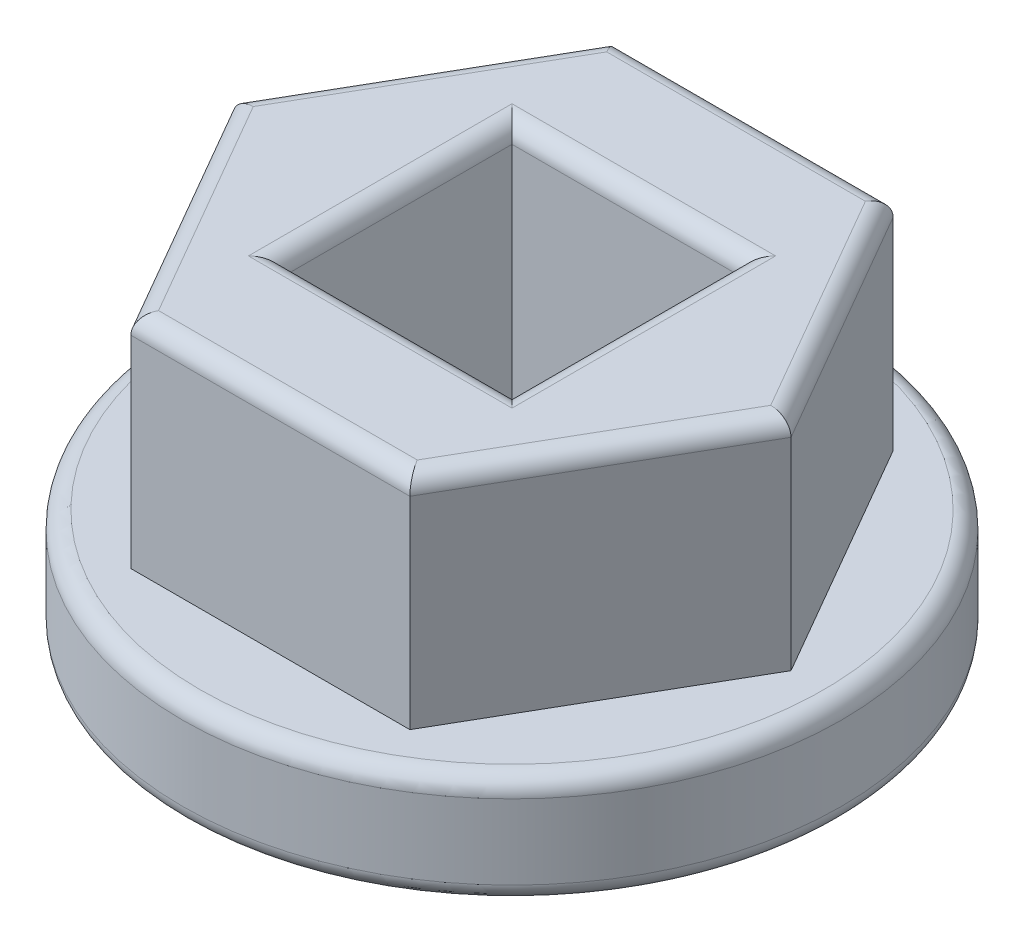
ISO-10303-21;
HEADER;
FILE_DESCRIPTION(('STEP AP214'),'2;1');
FILE_NAME('part.step','',(''),(''),'','','');
FILE_SCHEMA(('AUTOMOTIVE_DESIGN { 1 0 10303 214 1 1 1 1 }'));
ENDSEC;
DATA;
#1=APPLICATION_CONTEXT('core data for automotive mechanical design processes');
#2=APPLICATION_PROTOCOL_DEFINITION('international standard','automotive_design',2000,#1);
#3=PRODUCT_CONTEXT('',#1,'mechanical');
#4=PRODUCT('Part','Part','',(#3));
#5=PRODUCT_RELATED_PRODUCT_CATEGORY('part','',(#4));
#6=PRODUCT_DEFINITION_FORMATION('','',#4);
#7=PRODUCT_DEFINITION_CONTEXT('part definition',#1,'design');
#8=PRODUCT_DEFINITION('design','',#6,#7);
#9=PRODUCT_DEFINITION_SHAPE('','',#8);
#10=(LENGTH_UNIT() NAMED_UNIT(*) SI_UNIT(.MILLI.,.METRE.));
#11=(NAMED_UNIT(*) PLANE_ANGLE_UNIT() SI_UNIT($,.RADIAN.));
#12=(NAMED_UNIT(*) SI_UNIT($,.STERADIAN.) SOLID_ANGLE_UNIT());
#13=UNCERTAINTY_MEASURE_WITH_UNIT(LENGTH_MEASURE(1.E-05),#10,'distance_accuracy_value','');
#14=(GEOMETRIC_REPRESENTATION_CONTEXT(3) GLOBAL_UNCERTAINTY_ASSIGNED_CONTEXT((#13)) GLOBAL_UNIT_ASSIGNED_CONTEXT((#10,
#11,#12)) REPRESENTATION_CONTEXT('',''));
#15=CARTESIAN_POINT('',(0.,0.,0.));
#16=DIRECTION('',(0.,0.,1.));
#17=DIRECTION('',(1.,0.,0.));
#18=AXIS2_PLACEMENT_3D('',#15,#16,#17);
#19=CARTESIAN_POINT('',(0.,6.35,0.));
#20=DIRECTION('',(0.,1.,0.));
#21=DIRECTION('',(0.,0.,1.));
#22=AXIS2_PLACEMENT_3D('',#19,#20,#21);
#23=PLANE('',#22);
#24=DIRECTION('',(1.,0.,0.));
#25=VECTOR('',#24,1.);
#26=CARTESIAN_POINT('',(0.,6.35,3.81));
#27=LINE('',#26,#25);
#28=CARTESIAN_POINT('',(3.81,6.35,3.81));
#29=VERTEX_POINT('',#28);
#30=CARTESIAN_POINT('',(-3.81,6.35,3.81));
#31=VERTEX_POINT('',#30);
#32=EDGE_CURVE('E261',#29,#31,#27,.F.);
#33=ORIENTED_EDGE('',*,*,#32,.T.);
#34=DIRECTION('',(0.,0.,1.));
#35=VECTOR('',#34,1.);
#36=CARTESIAN_POINT('',(-3.81,6.35,0.));
#37=LINE('',#36,#35);
#38=CARTESIAN_POINT('',(-3.81,6.35,-3.81));
#39=VERTEX_POINT('',#38);
#40=EDGE_CURVE('E264',#31,#39,#37,.F.);
#41=ORIENTED_EDGE('',*,*,#40,.T.);
#42=DIRECTION('',(-1.,0.,0.));
#43=VECTOR('',#42,1.);
#44=CARTESIAN_POINT('',(0.,6.35,-3.81));
#45=LINE('',#44,#43);
#46=CARTESIAN_POINT('',(3.81,6.35,-3.81));
#47=VERTEX_POINT('',#46);
#48=EDGE_CURVE('E255',#39,#47,#45,.F.);
#49=ORIENTED_EDGE('',*,*,#48,.T.);
#50=DIRECTION('',(0.,0.,-1.));
#51=VECTOR('',#50,1.);
#52=CARTESIAN_POINT('',(3.81,6.35,0.));
#53=LINE('',#52,#51);
#54=EDGE_CURVE('E258',#47,#29,#53,.F.);
#55=ORIENTED_EDGE('',*,*,#54,.T.);
#56=EDGE_LOOP('',(#33,#41,#49,#55));
#57=FACE_BOUND('',#56,.T.);
#58=DIRECTION('',(0.5,0.,0.866025403784439));
#59=VECTOR('',#58,1.);
#60=CARTESIAN_POINT('',(-3.59285072516704,6.35,6.731));
#61=LINE('',#60,#59);
#62=CARTESIAN_POINT('',(-7.47899538708241,6.35,0.));
#63=VERTEX_POINT('',#62);
#64=CARTESIAN_POINT('',(-3.73949769354121,6.35,6.477));
#65=VERTEX_POINT('',#64);
#66=EDGE_CURVE('E248',#63,#65,#61,.T.);
#67=ORIENTED_EDGE('',*,*,#66,.T.);
#68=DIRECTION('',(1.,0.,0.));
#69=VECTOR('',#68,1.);
#70=CARTESIAN_POINT('',(4.03279163028954,6.35,6.477));
#71=LINE('',#70,#69);
#72=CARTESIAN_POINT('',(3.73949769354121,6.35,6.477));
#73=VERTEX_POINT('',#72);
#74=EDGE_CURVE('E251',#65,#73,#71,.T.);
#75=ORIENTED_EDGE('',*,*,#74,.T.);
#76=DIRECTION('',(0.5,0.,-0.866025403784439));
#77=VECTOR('',#76,1.);
#78=CARTESIAN_POINT('',(7.62564235545658,6.35,-0.253999999999999));
#79=LINE('',#78,#77);
#80=CARTESIAN_POINT('',(7.47899538708241,6.35,0.));
#81=VERTEX_POINT('',#80);
#82=EDGE_CURVE('E236',#73,#81,#79,.T.);
#83=ORIENTED_EDGE('',*,*,#82,.T.);
#84=DIRECTION('',(-0.5,0.,-0.866025403784439));
#85=VECTOR('',#84,1.);
#86=CARTESIAN_POINT('',(3.59285072516704,6.35,-6.731));
#87=LINE('',#86,#85);
#88=CARTESIAN_POINT('',(3.73949769354121,6.35,-6.477));
#89=VERTEX_POINT('',#88);
#90=EDGE_CURVE('E239',#81,#89,#87,.T.);
#91=ORIENTED_EDGE('',*,*,#90,.T.);
#92=DIRECTION('',(-1.,0.,0.));
#93=VECTOR('',#92,1.);
#94=CARTESIAN_POINT('',(-4.03279163028954,6.35,-6.477));
#95=LINE('',#94,#93);
#96=CARTESIAN_POINT('',(-3.73949769354121,6.35,-6.477));
#97=VERTEX_POINT('',#96);
#98=EDGE_CURVE('E242',#89,#97,#95,.T.);
#99=ORIENTED_EDGE('',*,*,#98,.T.);
#100=DIRECTION('',(-0.5,0.,0.866025403784439));
#101=VECTOR('',#100,1.);
#102=CARTESIAN_POINT('',(-7.62564235545658,6.35,0.254000000000003));
#103=LINE('',#102,#101);
#104=EDGE_CURVE('E245',#97,#63,#103,.T.);
#105=ORIENTED_EDGE('',*,*,#104,.T.);
#106=EDGE_LOOP('',(#67,#75,#83,#91,#99,#105));
#107=FACE_BOUND('',#106,.T.);
#108=ADVANCED_FACE('F43',(#57,#107),#23,.T.);
#109=CARTESIAN_POINT('',(4.03279163028954,6.35,6.985));
#110=DIRECTION('',(-0.866025403784439,0.,-0.5));
#111=DIRECTION('',(-0.5,0.,0.866025403784439));
#112=AXIS2_PLACEMENT_3D('',#109,#110,#111);
#113=PLANE('',#112);
#114=DIRECTION('',(0.,-1.,0.));
#115=VECTOR('',#114,1.);
#116=CARTESIAN_POINT('',(8.06558326057907,6.35,0.));
#117=LINE('',#116,#115);
#118=CARTESIAN_POINT('',(8.06558326057907,5.842,0.));
#119=VERTEX_POINT('',#118);
#120=CARTESIAN_POINT('',(8.06558326057907,0.,0.));
#121=VERTEX_POINT('',#120);
#122=EDGE_CURVE('E165',#119,#121,#117,.T.);
#123=ORIENTED_EDGE('',*,*,#122,.F.);
#124=DIRECTION('',(0.5,0.,-0.866025403784439));
#125=VECTOR('',#124,1.);
#126=CARTESIAN_POINT('',(4.03279163028954,5.842,6.985));
#127=LINE('',#126,#125);
#128=CARTESIAN_POINT('',(4.03279163028954,5.842,6.985));
#129=VERTEX_POINT('',#128);
#130=EDGE_CURVE('E301',#119,#129,#127,.F.);
#131=ORIENTED_EDGE('',*,*,#130,.T.);
#132=DIRECTION('',(0.,-1.,0.));
#133=VECTOR('',#132,1.);
#134=CARTESIAN_POINT('',(4.03279163028954,6.35,6.985));
#135=LINE('',#134,#133);
#136=CARTESIAN_POINT('',(4.03279163028954,0.,6.985));
#137=VERTEX_POINT('',#136);
#138=EDGE_CURVE('E193',#129,#137,#135,.T.);
#139=ORIENTED_EDGE('',*,*,#138,.T.);
#140=DIRECTION('',(0.5,0.,-0.866025403784439));
#141=VECTOR('',#140,1.);
#142=CARTESIAN_POINT('',(4.03279163028954,0.,6.985));
#143=LINE('',#142,#141);
#144=EDGE_CURVE('E184',#137,#121,#143,.T.);
#145=ORIENTED_EDGE('',*,*,#144,.T.);
#146=EDGE_LOOP('',(#123,#131,#139,#145));
#147=FACE_BOUND('',#146,.T.);
#148=ADVANCED_FACE('F191',(#147),#113,.F.);
#149=CARTESIAN_POINT('',(8.06558326057907,6.35,0.));
#150=DIRECTION('',(-0.866025403784439,0.,0.5));
#151=DIRECTION('',(0.5,0.,0.866025403784439));
#152=AXIS2_PLACEMENT_3D('',#149,#150,#151);
#153=PLANE('',#152);
#154=DIRECTION('',(0.,-1.,0.));
#155=VECTOR('',#154,1.);
#156=CARTESIAN_POINT('',(4.03279163028954,6.35,-6.985));
#157=LINE('',#156,#155);
#158=CARTESIAN_POINT('',(4.03279163028954,5.842,-6.985));
#159=VERTEX_POINT('',#158);
#160=CARTESIAN_POINT('',(4.03279163028954,0.,-6.985));
#161=VERTEX_POINT('',#160);
#162=EDGE_CURVE('E177',#159,#161,#157,.T.);
#163=ORIENTED_EDGE('',*,*,#162,.F.);
#164=DIRECTION('',(-0.5,0.,-0.866025403784439));
#165=VECTOR('',#164,1.);
#166=CARTESIAN_POINT('',(8.06558326057907,5.842,0.));
#167=LINE('',#166,#165);
#168=EDGE_CURVE('E171',#159,#119,#167,.F.);
#169=ORIENTED_EDGE('',*,*,#168,.T.);
#170=ORIENTED_EDGE('',*,*,#122,.T.);
#171=DIRECTION('',(-0.5,0.,-0.866025403784439));
#172=VECTOR('',#171,1.);
#173=CARTESIAN_POINT('',(8.06558326057907,0.,0.));
#174=LINE('',#173,#172);
#175=EDGE_CURVE('E169',#121,#161,#174,.T.);
#176=ORIENTED_EDGE('',*,*,#175,.T.);
#177=EDGE_LOOP('',(#163,#169,#170,#176));
#178=FACE_BOUND('',#177,.T.);
#179=ADVANCED_FACE('F168',(#178),#153,.F.);
#180=CARTESIAN_POINT('',(4.03279163028954,6.35,-6.985));
#181=DIRECTION('',(0.,0.,1.));
#182=DIRECTION('',(1.,0.,0.));
#183=AXIS2_PLACEMENT_3D('',#180,#181,#182);
#184=PLANE('',#183);
#185=DIRECTION('',(0.,-1.,0.));
#186=VECTOR('',#185,1.);
#187=CARTESIAN_POINT('',(-4.03279163028954,6.35,-6.985));
#188=LINE('',#187,#186);
#189=CARTESIAN_POINT('',(-4.03279163028954,5.842,-6.985));
#190=VERTEX_POINT('',#189);
#191=CARTESIAN_POINT('',(-4.03279163028954,0.,-6.985));
#192=VERTEX_POINT('',#191);
#193=EDGE_CURVE('E224',#190,#192,#188,.T.);
#194=ORIENTED_EDGE('',*,*,#193,.F.);
#195=DIRECTION('',(-1.,0.,0.));
#196=VECTOR('',#195,1.);
#197=CARTESIAN_POINT('',(4.03279163028954,5.842,-6.985));
#198=LINE('',#197,#196);
#199=EDGE_CURVE('E296',#190,#159,#198,.F.);
#200=ORIENTED_EDGE('',*,*,#199,.T.);
#201=ORIENTED_EDGE('',*,*,#162,.T.);
#202=DIRECTION('',(-1.,0.,0.));
#203=VECTOR('',#202,1.);
#204=CARTESIAN_POINT('',(4.03279163028954,0.,-6.985));
#205=LINE('',#204,#203);
#206=EDGE_CURVE('E188',#161,#192,#205,.T.);
#207=ORIENTED_EDGE('',*,*,#206,.T.);
#208=EDGE_LOOP('',(#194,#200,#201,#207));
#209=FACE_BOUND('',#208,.T.);
#210=ADVANCED_FACE('F429',(#209),#184,.F.);
#211=CARTESIAN_POINT('',(-4.03279163028954,6.35,-6.985));
#212=DIRECTION('',(0.866025403784439,0.,0.5));
#213=DIRECTION('',(0.5,0.,-0.866025403784439));
#214=AXIS2_PLACEMENT_3D('',#211,#212,#213);
#215=PLANE('',#214);
#216=DIRECTION('',(0.,-1.,0.));
#217=VECTOR('',#216,1.);
#218=CARTESIAN_POINT('',(-8.06558326057907,6.35,0.));
#219=LINE('',#218,#217);
#220=CARTESIAN_POINT('',(-8.06558326057907,5.842,0.));
#221=VERTEX_POINT('',#220);
#222=CARTESIAN_POINT('',(-8.06558326057907,0.,0.));
#223=VERTEX_POINT('',#222);
#224=EDGE_CURVE('E221',#221,#223,#219,.T.);
#225=ORIENTED_EDGE('',*,*,#224,.F.);
#226=DIRECTION('',(-0.5,0.,0.866025403784439));
#227=VECTOR('',#226,1.);
#228=CARTESIAN_POINT('',(-4.03279163028954,5.842,-6.985));
#229=LINE('',#228,#227);
#230=EDGE_CURVE('E293',#221,#190,#229,.F.);
#231=ORIENTED_EDGE('',*,*,#230,.T.);
#232=ORIENTED_EDGE('',*,*,#193,.T.);
#233=DIRECTION('',(-0.5,0.,0.866025403784439));
#234=VECTOR('',#233,1.);
#235=CARTESIAN_POINT('',(-4.03279163028954,0.,-6.985));
#236=LINE('',#235,#234);
#237=EDGE_CURVE('E205',#192,#223,#236,.T.);
#238=ORIENTED_EDGE('',*,*,#237,.T.);
#239=EDGE_LOOP('',(#225,#231,#232,#238));
#240=FACE_BOUND('',#239,.T.);
#241=ADVANCED_FACE('F425',(#240),#215,.F.);
#242=CARTESIAN_POINT('',(-8.06558326057907,6.35,0.));
#243=DIRECTION('',(0.866025403784439,0.,-0.5));
#244=DIRECTION('',(-0.5,0.,-0.866025403784439));
#245=AXIS2_PLACEMENT_3D('',#242,#243,#244);
#246=PLANE('',#245);
#247=DIRECTION('',(0.,-1.,0.));
#248=VECTOR('',#247,1.);
#249=CARTESIAN_POINT('',(-4.03279163028954,6.35,6.985));
#250=LINE('',#249,#248);
#251=CARTESIAN_POINT('',(-4.03279163028954,5.842,6.985));
#252=VERTEX_POINT('',#251);
#253=CARTESIAN_POINT('',(-4.03279163028954,0.,6.985));
#254=VERTEX_POINT('',#253);
#255=EDGE_CURVE('E218',#252,#254,#250,.T.);
#256=ORIENTED_EDGE('',*,*,#255,.F.);
#257=DIRECTION('',(0.5,0.,0.866025403784439));
#258=VECTOR('',#257,1.);
#259=CARTESIAN_POINT('',(-8.06558326057907,5.842,0.));
#260=LINE('',#259,#258);
#261=EDGE_CURVE('E290',#252,#221,#260,.F.);
#262=ORIENTED_EDGE('',*,*,#261,.T.);
#263=ORIENTED_EDGE('',*,*,#224,.T.);
#264=DIRECTION('',(0.5,0.,0.866025403784438));
#265=VECTOR('',#264,1.);
#266=CARTESIAN_POINT('',(-8.06558326057907,0.,0.));
#267=LINE('',#266,#265);
#268=EDGE_CURVE('E209',#223,#254,#267,.T.);
#269=ORIENTED_EDGE('',*,*,#268,.T.);
#270=EDGE_LOOP('',(#256,#262,#263,#269));
#271=FACE_BOUND('',#270,.T.);
#272=ADVANCED_FACE('F421',(#271),#246,.F.);
#273=CARTESIAN_POINT('',(-4.03279163028954,6.35,6.985));
#274=DIRECTION('',(0.,0.,-1.));
#275=DIRECTION('',(-1.,0.,0.));
#276=AXIS2_PLACEMENT_3D('',#273,#274,#275);
#277=PLANE('',#276);
#278=ORIENTED_EDGE('',*,*,#138,.F.);
#279=DIRECTION('',(1.,0.,0.));
#280=VECTOR('',#279,1.);
#281=CARTESIAN_POINT('',(-4.03279163028954,5.842,6.985));
#282=LINE('',#281,#280);
#283=EDGE_CURVE('E286',#129,#252,#282,.F.);
#284=ORIENTED_EDGE('',*,*,#283,.T.);
#285=ORIENTED_EDGE('',*,*,#255,.T.);
#286=DIRECTION('',(1.,0.,0.));
#287=VECTOR('',#286,1.);
#288=CARTESIAN_POINT('',(-4.03279163028954,0.,6.985));
#289=LINE('',#288,#287);
#290=EDGE_CURVE('E213',#254,#137,#289,.T.);
#291=ORIENTED_EDGE('',*,*,#290,.T.);
#292=EDGE_LOOP('',(#278,#284,#285,#291));
#293=FACE_BOUND('',#292,.T.);
#294=ADVANCED_FACE('F418',(#293),#277,.F.);
#295=CARTESIAN_POINT('',(3.302,6.35,-3.302));
#296=DIRECTION('',(-1.,0.,0.));
#297=DIRECTION('',(0.,0.,1.));
#298=AXIS2_PLACEMENT_3D('',#295,#296,#297);
#299=PLANE('',#298);
#300=DIRECTION('',(0.,-1.,0.));
#301=VECTOR('',#300,1.);
#302=CARTESIAN_POINT('',(3.302,6.35,3.302));
#303=LINE('',#302,#301);
#304=CARTESIAN_POINT('',(3.302,5.842,3.302));
#305=VERTEX_POINT('',#304);
#306=CARTESIAN_POINT('',(3.302,-2.667,3.302));
#307=VERTEX_POINT('',#306);
#308=EDGE_CURVE('E340',#305,#307,#303,.T.);
#309=ORIENTED_EDGE('',*,*,#308,.F.);
#310=DIRECTION('',(0.,0.,-1.));
#311=VECTOR('',#310,1.);
#312=CARTESIAN_POINT('',(3.302,5.842,-3.302));
#313=LINE('',#312,#311);
#314=CARTESIAN_POINT('',(3.302,5.842,-3.302));
#315=VERTEX_POINT('',#314);
#316=EDGE_CURVE('E277',#305,#315,#313,.T.);
#317=ORIENTED_EDGE('',*,*,#316,.T.);
#318=DIRECTION('',(0.,-1.,0.));
#319=VECTOR('',#318,1.);
#320=CARTESIAN_POINT('',(3.302,6.35,-3.302));
#321=LINE('',#320,#319);
#322=CARTESIAN_POINT('',(3.302,-2.667,-3.302));
#323=VERTEX_POINT('',#322);
#324=EDGE_CURVE('E195',#315,#323,#321,.T.);
#325=ORIENTED_EDGE('',*,*,#324,.T.);
#326=DIRECTION('',(0.,0.,1.));
#327=VECTOR('',#326,1.);
#328=CARTESIAN_POINT('',(3.302,-2.667,-3.302));
#329=LINE('',#328,#327);
#330=EDGE_CURVE('E274',#323,#307,#329,.T.);
#331=ORIENTED_EDGE('',*,*,#330,.T.);
#332=EDGE_LOOP('',(#309,#317,#325,#331));
#333=FACE_BOUND('',#332,.T.);
#334=ADVANCED_FACE('F416',(#333),#299,.T.);
#335=CARTESIAN_POINT('',(-3.302,6.35,-3.302));
#336=DIRECTION('',(0.,0.,1.));
#337=DIRECTION('',(1.,0.,0.));
#338=AXIS2_PLACEMENT_3D('',#335,#336,#337);
#339=PLANE('',#338);
#340=ORIENTED_EDGE('',*,*,#324,.F.);
#341=DIRECTION('',(-1.,0.,0.));
#342=VECTOR('',#341,1.);
#343=CARTESIAN_POINT('',(-3.302,5.842,-3.302));
#344=LINE('',#343,#342);
#345=CARTESIAN_POINT('',(-3.302,5.842,-3.302));
#346=VERTEX_POINT('',#345);
#347=EDGE_CURVE('E283',#315,#346,#344,.T.);
#348=ORIENTED_EDGE('',*,*,#347,.T.);
#349=DIRECTION('',(0.,-1.,0.));
#350=VECTOR('',#349,1.);
#351=CARTESIAN_POINT('',(-3.302,6.35,-3.302));
#352=LINE('',#351,#350);
#353=CARTESIAN_POINT('',(-3.302,-2.667,-3.302));
#354=VERTEX_POINT('',#353);
#355=EDGE_CURVE('E199',#346,#354,#352,.T.);
#356=ORIENTED_EDGE('',*,*,#355,.T.);
#357=DIRECTION('',(1.,0.,0.));
#358=VECTOR('',#357,1.);
#359=CARTESIAN_POINT('',(-3.302,-2.667,-3.302));
#360=LINE('',#359,#358);
#361=EDGE_CURVE('E280',#354,#323,#360,.T.);
#362=ORIENTED_EDGE('',*,*,#361,.T.);
#363=EDGE_LOOP('',(#340,#348,#356,#362));
#364=FACE_BOUND('',#363,.T.);
#365=ADVANCED_FACE('F628',(#364),#339,.T.);
#366=CARTESIAN_POINT('',(-3.302,6.35,-3.302));
#367=DIRECTION('',(1.,0.,0.));
#368=DIRECTION('',(0.,0.,-1.));
#369=AXIS2_PLACEMENT_3D('',#366,#367,#368);
#370=PLANE('',#369);
#371=ORIENTED_EDGE('',*,*,#355,.F.);
#372=DIRECTION('',(0.,0.,1.));
#373=VECTOR('',#372,1.);
#374=CARTESIAN_POINT('',(-3.302,5.842,-3.302));
#375=LINE('',#374,#373);
#376=CARTESIAN_POINT('',(-3.302,5.842,3.302));
#377=VERTEX_POINT('',#376);
#378=EDGE_CURVE('E232',#346,#377,#375,.T.);
#379=ORIENTED_EDGE('',*,*,#378,.T.);
#380=DIRECTION('',(0.,-1.,0.));
#381=VECTOR('',#380,1.);
#382=CARTESIAN_POINT('',(-3.302,6.35,3.302));
#383=LINE('',#382,#381);
#384=CARTESIAN_POINT('',(-3.302,-2.667,3.302));
#385=VERTEX_POINT('',#384);
#386=EDGE_CURVE('E752',#377,#385,#383,.T.);
#387=ORIENTED_EDGE('',*,*,#386,.T.);
#388=DIRECTION('',(0.,0.,-1.));
#389=VECTOR('',#388,1.);
#390=CARTESIAN_POINT('',(-3.302,-2.667,-3.302));
#391=LINE('',#390,#389);
#392=EDGE_CURVE('E176',#385,#354,#391,.T.);
#393=ORIENTED_EDGE('',*,*,#392,.T.);
#394=EDGE_LOOP('',(#371,#379,#387,#393));
#395=FACE_BOUND('',#394,.T.);
#396=ADVANCED_FACE('F618',(#395),#370,.T.);
#397=CARTESIAN_POINT('',(-3.302,6.35,3.302));
#398=DIRECTION('',(0.,0.,-1.));
#399=DIRECTION('',(-1.,0.,0.));
#400=AXIS2_PLACEMENT_3D('',#397,#398,#399);
#401=PLANE('',#400);
#402=ORIENTED_EDGE('',*,*,#386,.F.);
#403=DIRECTION('',(1.,0.,0.));
#404=VECTOR('',#403,1.);
#405=CARTESIAN_POINT('',(-3.302,5.842,3.302));
#406=LINE('',#405,#404);
#407=EDGE_CURVE('E271',#377,#305,#406,.T.);
#408=ORIENTED_EDGE('',*,*,#407,.T.);
#409=ORIENTED_EDGE('',*,*,#308,.T.);
#410=DIRECTION('',(-1.,0.,0.));
#411=VECTOR('',#410,1.);
#412=CARTESIAN_POINT('',(-3.302,-2.667,3.302));
#413=LINE('',#412,#411);
#414=EDGE_CURVE('E268',#307,#385,#413,.T.);
#415=ORIENTED_EDGE('',*,*,#414,.T.);
#416=EDGE_LOOP('',(#402,#408,#409,#415));
#417=FACE_BOUND('',#416,.T.);
#418=ADVANCED_FACE('F391',(#417),#401,.T.);
#419=CARTESIAN_POINT('',(0.,-3.175,0.));
#420=DIRECTION('',(0.,-1.,0.));
#421=DIRECTION('',(0.,0.,-1.));
#422=AXIS2_PLACEMENT_3D('',#419,#420,#421);
#423=PLANE('',#422);
#424=DIRECTION('',(1.,0.,0.));
#425=VECTOR('',#424,1.);
#426=CARTESIAN_POINT('',(0.,-3.175,-3.81));
#427=LINE('',#426,#425);
#428=CARTESIAN_POINT('',(3.81,-3.175,-3.81));
#429=VERTEX_POINT('',#428);
#430=CARTESIAN_POINT('',(-3.81,-3.175,-3.81));
#431=VERTEX_POINT('',#430);
#432=EDGE_CURVE('E61',#429,#431,#427,.F.);
#433=ORIENTED_EDGE('',*,*,#432,.T.);
#434=DIRECTION('',(0.,0.,-1.));
#435=VECTOR('',#434,1.);
#436=CARTESIAN_POINT('',(-3.81,-3.175,0.));
#437=LINE('',#436,#435);
#438=CARTESIAN_POINT('',(-3.81,-3.175,3.81));
#439=VERTEX_POINT('',#438);
#440=EDGE_CURVE('E315',#431,#439,#437,.F.);
#441=ORIENTED_EDGE('',*,*,#440,.T.);
#442=DIRECTION('',(-1.,0.,0.));
#443=VECTOR('',#442,1.);
#444=CARTESIAN_POINT('',(0.,-3.175,3.81));
#445=LINE('',#444,#443);
#446=CARTESIAN_POINT('',(3.81,-3.175,3.81));
#447=VERTEX_POINT('',#446);
#448=EDGE_CURVE('E308',#439,#447,#445,.F.);
#449=ORIENTED_EDGE('',*,*,#448,.T.);
#450=DIRECTION('',(0.,0.,1.));
#451=VECTOR('',#450,1.);
#452=CARTESIAN_POINT('',(3.81,-3.175,0.));
#453=LINE('',#452,#451);
#454=EDGE_CURVE('E66',#447,#429,#453,.F.);
#455=ORIENTED_EDGE('',*,*,#454,.T.);
#456=EDGE_LOOP('',(#433,#441,#449,#455));
#457=FACE_BOUND('',#456,.T.);
#458=CARTESIAN_POINT('',(0.,-3.175,0.));
#459=DIRECTION('',(0.,-1.,0.));
#460=DIRECTION('',(0.,0.,-1.));
#461=AXIS2_PLACEMENT_3D('',#458,#459,#460);
#462=CIRCLE('',#461,9.017);
#463=CARTESIAN_POINT('',(0.,-3.175,-9.017));
#464=VERTEX_POINT('',#463);
#465=EDGE_CURVE('E304',#464,#464,#462,.T.);
#466=ORIENTED_EDGE('',*,*,#465,.T.);
#467=EDGE_LOOP('',(#466));
#468=FACE_BOUND('',#467,.T.);
#469=ADVANCED_FACE('F388',(#457,#468),#423,.T.);
#470=CARTESIAN_POINT('',(0.,0.,0.));
#471=DIRECTION('',(0.,-1.,0.));
#472=DIRECTION('',(0.,0.,-1.));
#473=AXIS2_PLACEMENT_3D('',#470,#471,#472);
#474=PLANE('',#473);
#475=CARTESIAN_POINT('',(0.,0.,0.));
#476=DIRECTION('',(0.,-1.,0.));
#477=DIRECTION('',(0.,0.,-1.));
#478=AXIS2_PLACEMENT_3D('',#475,#476,#477);
#479=CIRCLE('',#478,9.017);
#480=CARTESIAN_POINT('',(0.,0.,-9.017));
#481=VERTEX_POINT('',#480);
#482=EDGE_CURVE('E11',#481,#481,#479,.F.);
#483=ORIENTED_EDGE('',*,*,#482,.T.);
#484=EDGE_LOOP('',(#483));
#485=FACE_BOUND('',#484,.T.);
#486=ORIENTED_EDGE('',*,*,#144,.F.);
#487=ORIENTED_EDGE('',*,*,#290,.F.);
#488=ORIENTED_EDGE('',*,*,#268,.F.);
#489=ORIENTED_EDGE('',*,*,#237,.F.);
#490=ORIENTED_EDGE('',*,*,#206,.F.);
#491=ORIENTED_EDGE('',*,*,#175,.F.);
#492=EDGE_LOOP('',(#486,#487,#488,#489,#490,#491));
#493=FACE_BOUND('',#492,.T.);
#494=ADVANCED_FACE('F182',(#485,#493),#474,.F.);
#495=CARTESIAN_POINT('',(0.,-3.175,0.));
#496=DIRECTION('',(0.,1.,0.));
#497=DIRECTION('',(0.,0.,1.));
#498=AXIS2_PLACEMENT_3D('',#495,#496,#497);
#499=CYLINDRICAL_SURFACE('',#498,9.525);
#500=CARTESIAN_POINT('',(0.,-2.667,0.));
#501=DIRECTION('',(0.,-1.,0.));
#502=DIRECTION('',(0.,0.,-1.));
#503=AXIS2_PLACEMENT_3D('',#500,#501,#502);
#504=CIRCLE('',#503,9.525);
#505=CARTESIAN_POINT('',(0.,-2.667,-9.525));
#506=VERTEX_POINT('',#505);
#507=EDGE_CURVE('E53',#506,#506,#504,.F.);
#508=ORIENTED_EDGE('',*,*,#507,.T.);
#509=EDGE_LOOP('',(#508));
#510=FACE_BOUND('',#509,.T.);
#511=CARTESIAN_POINT('',(0.,-0.508,0.));
#512=DIRECTION('',(0.,-1.,0.));
#513=DIRECTION('',(0.,0.,-1.));
#514=AXIS2_PLACEMENT_3D('',#511,#512,#513);
#515=CIRCLE('',#514,9.525);
#516=CARTESIAN_POINT('',(0.,-0.508,-9.525));
#517=VERTEX_POINT('',#516);
#518=EDGE_CURVE('E318',#517,#517,#515,.T.);
#519=ORIENTED_EDGE('',*,*,#518,.T.);
#520=EDGE_LOOP('',(#519));
#521=FACE_BOUND('',#520,.T.);
#522=ADVANCED_FACE('F452',(#510,#521),#499,.T.);
#523=CARTESIAN_POINT('',(3.81,5.842,-3.302));
#524=DIRECTION('',(0.,0.,-1.));
#525=DIRECTION('',(-1.,0.,0.));
#526=AXIS2_PLACEMENT_3D('',#523,#524,#525);
#527=CYLINDRICAL_SURFACE('',#526,0.508);
#528=CARTESIAN_POINT('',(3.81,5.842,3.81));
#529=DIRECTION('',(0.707106781186547,0.,-0.707106781186548));
#530=DIRECTION('',(0.707106781186547,0.,0.707106781186547));
#531=AXIS2_PLACEMENT_3D('',#528,#529,#530);
#532=ELLIPSE('',#531,0.718420489685532,0.508);
#533=EDGE_CURVE('E332',#29,#305,#532,.F.);
#534=ORIENTED_EDGE('',*,*,#533,.F.);
#535=ORIENTED_EDGE('',*,*,#54,.F.);
#536=CARTESIAN_POINT('',(3.81,5.842,-3.81));
#537=DIRECTION('',(-0.707106781186547,0.,-0.707106781186547));
#538=DIRECTION('',(0.707106781186547,0.,-0.707106781186548));
#539=AXIS2_PLACEMENT_3D('',#536,#537,#538);
#540=ELLIPSE('',#539,0.718420489685532,0.508);
#541=EDGE_CURVE('E336',#315,#47,#540,.T.);
#542=ORIENTED_EDGE('',*,*,#541,.F.);
#543=ORIENTED_EDGE('',*,*,#316,.F.);
#544=EDGE_LOOP('',(#534,#535,#542,#543));
#545=FACE_BOUND('',#544,.T.);
#546=ADVANCED_FACE('F448',(#545),#527,.T.);
#547=CARTESIAN_POINT('',(-3.302,5.842,-3.81));
#548=DIRECTION('',(-1.,0.,0.));
#549=DIRECTION('',(0.,0.,1.));
#550=AXIS2_PLACEMENT_3D('',#547,#548,#549);
#551=CYLINDRICAL_SURFACE('',#550,0.508);
#552=ORIENTED_EDGE('',*,*,#541,.T.);
#553=ORIENTED_EDGE('',*,*,#48,.F.);
#554=CARTESIAN_POINT('',(-3.81,5.842,-3.81));
#555=DIRECTION('',(-0.707106781186547,0.,0.707106781186548));
#556=DIRECTION('',(0.707106781186548,0.,0.707106781186547));
#557=AXIS2_PLACEMENT_3D('',#554,#555,#556);
#558=ELLIPSE('',#557,0.718420489685532,0.508);
#559=EDGE_CURVE('E328',#346,#39,#558,.T.);
#560=ORIENTED_EDGE('',*,*,#559,.F.);
#561=ORIENTED_EDGE('',*,*,#347,.F.);
#562=EDGE_LOOP('',(#552,#553,#560,#561));
#563=FACE_BOUND('',#562,.T.);
#564=ADVANCED_FACE('F444',(#563),#551,.T.);
#565=CARTESIAN_POINT('',(-3.302,5.842,3.81));
#566=DIRECTION('',(1.,0.,0.));
#567=DIRECTION('',(0.,0.,-1.));
#568=AXIS2_PLACEMENT_3D('',#565,#566,#567);
#569=CYLINDRICAL_SURFACE('',#568,0.508);
#570=ORIENTED_EDGE('',*,*,#533,.T.);
#571=ORIENTED_EDGE('',*,*,#407,.F.);
#572=CARTESIAN_POINT('',(-3.81,5.842,3.81));
#573=DIRECTION('',(0.707106781186548,0.,0.707106781186547));
#574=DIRECTION('',(-0.707106781186547,0.,0.707106781186548));
#575=AXIS2_PLACEMENT_3D('',#572,#573,#574);
#576=ELLIPSE('',#575,0.718420489685532,0.508);
#577=EDGE_CURVE('E325',#31,#377,#576,.F.);
#578=ORIENTED_EDGE('',*,*,#577,.F.);
#579=ORIENTED_EDGE('',*,*,#32,.F.);
#580=EDGE_LOOP('',(#570,#571,#578,#579));
#581=FACE_BOUND('',#580,.T.);
#582=ADVANCED_FACE('F440',(#581),#569,.T.);
#583=CARTESIAN_POINT('',(-3.81,5.842,-3.302));
#584=DIRECTION('',(0.,0.,1.));
#585=DIRECTION('',(1.,0.,0.));
#586=AXIS2_PLACEMENT_3D('',#583,#584,#585);
#587=CYLINDRICAL_SURFACE('',#586,0.508);
#588=ORIENTED_EDGE('',*,*,#559,.T.);
#589=ORIENTED_EDGE('',*,*,#40,.F.);
#590=ORIENTED_EDGE('',*,*,#577,.T.);
#591=ORIENTED_EDGE('',*,*,#378,.F.);
#592=EDGE_LOOP('',(#588,#589,#590,#591));
#593=FACE_BOUND('',#592,.T.);
#594=ADVANCED_FACE('F436',(#593),#587,.T.);
#595=CARTESIAN_POINT('',(0.,5.842,-6.477));
#596=DIRECTION('',(1.,0.,0.));
#597=DIRECTION('',(0.,0.,-1.));
#598=AXIS2_PLACEMENT_3D('',#595,#596,#597);
#599=CYLINDRICAL_SURFACE('',#598,0.508);
#600=CARTESIAN_POINT('',(3.73949769354121,5.842,-6.477));
#601=DIRECTION('',(0.866025403784439,0.,0.5));
#602=DIRECTION('',(-0.5,0.,0.866025403784439));
#603=AXIS2_PLACEMENT_3D('',#600,#601,#602);
#604=ELLIPSE('',#603,0.58658787349666,0.508);
#605=EDGE_CURVE('E355',#159,#89,#604,.T.);
#606=ORIENTED_EDGE('',*,*,#605,.F.);
#607=ORIENTED_EDGE('',*,*,#199,.F.);
#608=CARTESIAN_POINT('',(-3.73949769354121,5.842,-6.477));
#609=DIRECTION('',(0.866025403784438,0.,-0.5));
#610=DIRECTION('',(0.5,0.,0.866025403784439));
#611=AXIS2_PLACEMENT_3D('',#608,#609,#610);
#612=ELLIPSE('',#611,0.58658787349666,0.508);
#613=EDGE_CURVE('E329',#97,#190,#612,.F.);
#614=ORIENTED_EDGE('',*,*,#613,.F.);
#615=ORIENTED_EDGE('',*,*,#98,.F.);
#616=EDGE_LOOP('',(#606,#607,#614,#615));
#617=FACE_BOUND('',#616,.T.);
#618=ADVANCED_FACE('F439',(#617),#599,.T.);
#619=CARTESIAN_POINT('',(-5.60924654031181,5.842,-3.2385));
#620=DIRECTION('',(0.5,0.,-0.866025403784439));
#621=DIRECTION('',(-0.866025403784439,0.,-0.5));
#622=AXIS2_PLACEMENT_3D('',#619,#620,#621);
#623=CYLINDRICAL_SURFACE('',#622,0.508);
#624=ORIENTED_EDGE('',*,*,#613,.T.);
#625=ORIENTED_EDGE('',*,*,#230,.F.);
#626=CARTESIAN_POINT('',(-7.47899538708241,5.842,0.));
#627=DIRECTION('',(0.,0.,-1.));
#628=DIRECTION('',(1.,0.,0.));
#629=AXIS2_PLACEMENT_3D('',#626,#627,#628);
#630=ELLIPSE('',#629,0.58658787349666,0.508);
#631=EDGE_CURVE('E351',#63,#221,#630,.F.);
#632=ORIENTED_EDGE('',*,*,#631,.F.);
#633=ORIENTED_EDGE('',*,*,#104,.F.);
#634=EDGE_LOOP('',(#624,#625,#632,#633));
#635=FACE_BOUND('',#634,.T.);
#636=ADVANCED_FACE('F469',(#635),#623,.T.);
#637=CARTESIAN_POINT('',(5.60924654031181,5.842,-3.2385));
#638=DIRECTION('',(0.5,0.,0.866025403784439));
#639=DIRECTION('',(0.866025403784439,0.,-0.5));
#640=AXIS2_PLACEMENT_3D('',#637,#638,#639);
#641=CYLINDRICAL_SURFACE('',#640,0.508);
#642=ORIENTED_EDGE('',*,*,#605,.T.);
#643=ORIENTED_EDGE('',*,*,#90,.F.);
#644=CARTESIAN_POINT('',(7.47899538708241,5.842,0.));
#645=DIRECTION('',(0.,0.,1.));
#646=DIRECTION('',(-1.,0.,0.));
#647=AXIS2_PLACEMENT_3D('',#644,#645,#646);
#648=ELLIPSE('',#647,0.58658787349666,0.508);
#649=EDGE_CURVE('E347',#119,#81,#648,.T.);
#650=ORIENTED_EDGE('',*,*,#649,.F.);
#651=ORIENTED_EDGE('',*,*,#168,.F.);
#652=EDGE_LOOP('',(#642,#643,#650,#651));
#653=FACE_BOUND('',#652,.T.);
#654=ADVANCED_FACE('F465',(#653),#641,.T.);
#655=CARTESIAN_POINT('',(-5.60924654031181,5.842,3.2385));
#656=DIRECTION('',(-0.5,0.,-0.866025403784439));
#657=DIRECTION('',(-0.866025403784439,0.,0.5));
#658=AXIS2_PLACEMENT_3D('',#655,#656,#657);
#659=CYLINDRICAL_SURFACE('',#658,0.508);
#660=ORIENTED_EDGE('',*,*,#631,.T.);
#661=ORIENTED_EDGE('',*,*,#261,.F.);
#662=CARTESIAN_POINT('',(-3.7394976935412,5.842,6.477));
#663=DIRECTION('',(-0.866025403784439,0.,-0.5));
#664=DIRECTION('',(0.5,0.,-0.866025403784439));
#665=AXIS2_PLACEMENT_3D('',#662,#663,#664);
#666=ELLIPSE('',#665,0.58658787349666,0.508);
#667=EDGE_CURVE('E344',#65,#252,#666,.F.);
#668=ORIENTED_EDGE('',*,*,#667,.F.);
#669=ORIENTED_EDGE('',*,*,#66,.F.);
#670=EDGE_LOOP('',(#660,#661,#668,#669));
#671=FACE_BOUND('',#670,.T.);
#672=ADVANCED_FACE('F461',(#671),#659,.T.);
#673=CARTESIAN_POINT('',(5.60924654031181,5.842,3.2385));
#674=DIRECTION('',(-0.5,0.,0.866025403784439));
#675=DIRECTION('',(0.866025403784439,0.,0.5));
#676=AXIS2_PLACEMENT_3D('',#673,#674,#675);
#677=CYLINDRICAL_SURFACE('',#676,0.508);
#678=ORIENTED_EDGE('',*,*,#649,.T.);
#679=ORIENTED_EDGE('',*,*,#82,.F.);
#680=CARTESIAN_POINT('',(3.73949769354121,5.842,6.477));
#681=DIRECTION('',(-0.866025403784439,0.,0.5));
#682=DIRECTION('',(0.5,0.,0.866025403784439));
#683=AXIS2_PLACEMENT_3D('',#680,#681,#682);
#684=ELLIPSE('',#683,0.58658787349666,0.508);
#685=EDGE_CURVE('E341',#129,#73,#684,.T.);
#686=ORIENTED_EDGE('',*,*,#685,.F.);
#687=ORIENTED_EDGE('',*,*,#130,.F.);
#688=EDGE_LOOP('',(#678,#679,#686,#687));
#689=FACE_BOUND('',#688,.T.);
#690=ADVANCED_FACE('F457',(#689),#677,.T.);
#691=CARTESIAN_POINT('',(0.,5.842,6.477));
#692=DIRECTION('',(-1.,0.,0.));
#693=DIRECTION('',(0.,0.,1.));
#694=AXIS2_PLACEMENT_3D('',#691,#692,#693);
#695=CYLINDRICAL_SURFACE('',#694,0.508);
#696=ORIENTED_EDGE('',*,*,#667,.T.);
#697=ORIENTED_EDGE('',*,*,#283,.F.);
#698=ORIENTED_EDGE('',*,*,#685,.T.);
#699=ORIENTED_EDGE('',*,*,#74,.F.);
#700=EDGE_LOOP('',(#696,#697,#698,#699));
#701=FACE_BOUND('',#700,.T.);
#702=ADVANCED_FACE('F454',(#701),#695,.T.);
#703=CARTESIAN_POINT('',(3.81,-2.667,-3.302));
#704=DIRECTION('',(0.,0.,1.));
#705=DIRECTION('',(1.,0.,0.));
#706=AXIS2_PLACEMENT_3D('',#703,#704,#705);
#707=CYLINDRICAL_SURFACE('',#706,0.508);
#708=CARTESIAN_POINT('',(3.81,-2.667,-3.81));
#709=DIRECTION('',(0.707106781186547,0.,0.707106781186547));
#710=DIRECTION('',(0.707106781186547,0.,-0.707106781186548));
#711=AXIS2_PLACEMENT_3D('',#708,#709,#710);
#712=ELLIPSE('',#711,0.718420489685532,0.508);
#713=EDGE_CURVE('E367',#429,#323,#712,.F.);
#714=ORIENTED_EDGE('',*,*,#713,.F.);
#715=ORIENTED_EDGE('',*,*,#454,.F.);
#716=CARTESIAN_POINT('',(3.81,-2.667,3.81));
#717=DIRECTION('',(-0.707106781186547,0.,0.707106781186548));
#718=DIRECTION('',(0.707106781186547,0.,0.707106781186547));
#719=AXIS2_PLACEMENT_3D('',#716,#717,#718);
#720=ELLIPSE('',#719,0.718420489685532,0.508);
#721=EDGE_CURVE('E47',#307,#447,#720,.T.);
#722=ORIENTED_EDGE('',*,*,#721,.F.);
#723=ORIENTED_EDGE('',*,*,#330,.F.);
#724=EDGE_LOOP('',(#714,#715,#722,#723));
#725=FACE_BOUND('',#724,.T.);
#726=ADVANCED_FACE('F382',(#725),#707,.T.);
#727=CARTESIAN_POINT('',(-3.302,-2.667,3.81));
#728=DIRECTION('',(-1.,0.,0.));
#729=DIRECTION('',(0.,0.,1.));
#730=AXIS2_PLACEMENT_3D('',#727,#728,#729);
#731=CYLINDRICAL_SURFACE('',#730,0.508);
#732=ORIENTED_EDGE('',*,*,#721,.T.);
#733=ORIENTED_EDGE('',*,*,#448,.F.);
#734=CARTESIAN_POINT('',(-3.81,-2.667,3.81));
#735=DIRECTION('',(-0.707106781186548,0.,-0.707106781186547));
#736=DIRECTION('',(0.707106781186547,0.,-0.707106781186548));
#737=AXIS2_PLACEMENT_3D('',#734,#735,#736);
#738=ELLIPSE('',#737,0.718420489685532,0.508);
#739=EDGE_CURVE('E365',#385,#439,#738,.T.);
#740=ORIENTED_EDGE('',*,*,#739,.F.);
#741=ORIENTED_EDGE('',*,*,#414,.F.);
#742=EDGE_LOOP('',(#732,#733,#740,#741));
#743=FACE_BOUND('',#742,.T.);
#744=ADVANCED_FACE('F378',(#743),#731,.T.);
#745=CARTESIAN_POINT('',(-3.302,-2.667,-3.81));
#746=DIRECTION('',(1.,0.,0.));
#747=DIRECTION('',(0.,0.,-1.));
#748=AXIS2_PLACEMENT_3D('',#745,#746,#747);
#749=CYLINDRICAL_SURFACE('',#748,0.508);
#750=ORIENTED_EDGE('',*,*,#713,.T.);
#751=ORIENTED_EDGE('',*,*,#361,.F.);
#752=CARTESIAN_POINT('',(-3.81,-2.667,-3.81));
#753=DIRECTION('',(0.707106781186547,0.,-0.707106781186548));
#754=DIRECTION('',(-0.707106781186548,0.,-0.707106781186547));
#755=AXIS2_PLACEMENT_3D('',#752,#753,#754);
#756=ELLIPSE('',#755,0.718420489685532,0.508);
#757=EDGE_CURVE('E362',#431,#354,#756,.F.);
#758=ORIENTED_EDGE('',*,*,#757,.F.);
#759=ORIENTED_EDGE('',*,*,#432,.F.);
#760=EDGE_LOOP('',(#750,#751,#758,#759));
#761=FACE_BOUND('',#760,.T.);
#762=ADVANCED_FACE('F384',(#761),#749,.T.);
#763=CARTESIAN_POINT('',(-3.81,-2.667,-3.302));
#764=DIRECTION('',(0.,0.,-1.));
#765=DIRECTION('',(-1.,0.,0.));
#766=AXIS2_PLACEMENT_3D('',#763,#764,#765);
#767=CYLINDRICAL_SURFACE('',#766,0.508);
#768=ORIENTED_EDGE('',*,*,#739,.T.);
#769=ORIENTED_EDGE('',*,*,#440,.F.);
#770=ORIENTED_EDGE('',*,*,#757,.T.);
#771=ORIENTED_EDGE('',*,*,#392,.F.);
#772=EDGE_LOOP('',(#768,#769,#770,#771));
#773=FACE_BOUND('',#772,.T.);
#774=ADVANCED_FACE('F387',(#773),#767,.T.);
#775=CARTESIAN_POINT('',(0.,-2.667,0.));
#776=DIRECTION('',(0.,-1.,0.));
#777=DIRECTION('',(0.,0.,-1.));
#778=AXIS2_PLACEMENT_3D('',#775,#776,#777);
#779=TOROIDAL_SURFACE('',#778,9.017,0.508);
#780=ORIENTED_EDGE('',*,*,#507,.F.);
#781=EDGE_LOOP('',(#780));
#782=FACE_BOUND('',#781,.T.);
#783=ORIENTED_EDGE('',*,*,#465,.F.);
#784=EDGE_LOOP('',(#783));
#785=FACE_BOUND('',#784,.T.);
#786=ADVANCED_FACE('F395',(#782,#785),#779,.T.);
#787=CARTESIAN_POINT('',(0.,-0.508,0.));
#788=DIRECTION('',(0.,-1.,0.));
#789=DIRECTION('',(0.,0.,-1.));
#790=AXIS2_PLACEMENT_3D('',#787,#788,#789);
#791=TOROIDAL_SURFACE('',#790,9.017,0.508);
#792=ORIENTED_EDGE('',*,*,#482,.F.);
#793=EDGE_LOOP('',(#792));
#794=FACE_BOUND('',#793,.T.);
#795=ORIENTED_EDGE('',*,*,#518,.F.);
#796=EDGE_LOOP('',(#795));
#797=FACE_BOUND('',#796,.T.);
#798=ADVANCED_FACE('F45',(#794,#797),#791,.T.);
#799=CLOSED_SHELL('',(#108,#148,#179,#210,#241,#272,#294,#334,#365,#396,#418,#469,#494,#522,
#546,#564,#582,#594,#618,#636,#654,#672,#690,#702,#726,#744,#762,#774,#786,#798));
#800=MANIFOLD_SOLID_BREP('B2',#799);
#801=ADVANCED_BREP_SHAPE_REPRESENTATION('',(#18,#800),#14);
#802=SHAPE_DEFINITION_REPRESENTATION(#9,#801);
ENDSEC;
END-ISO-10303-21;
